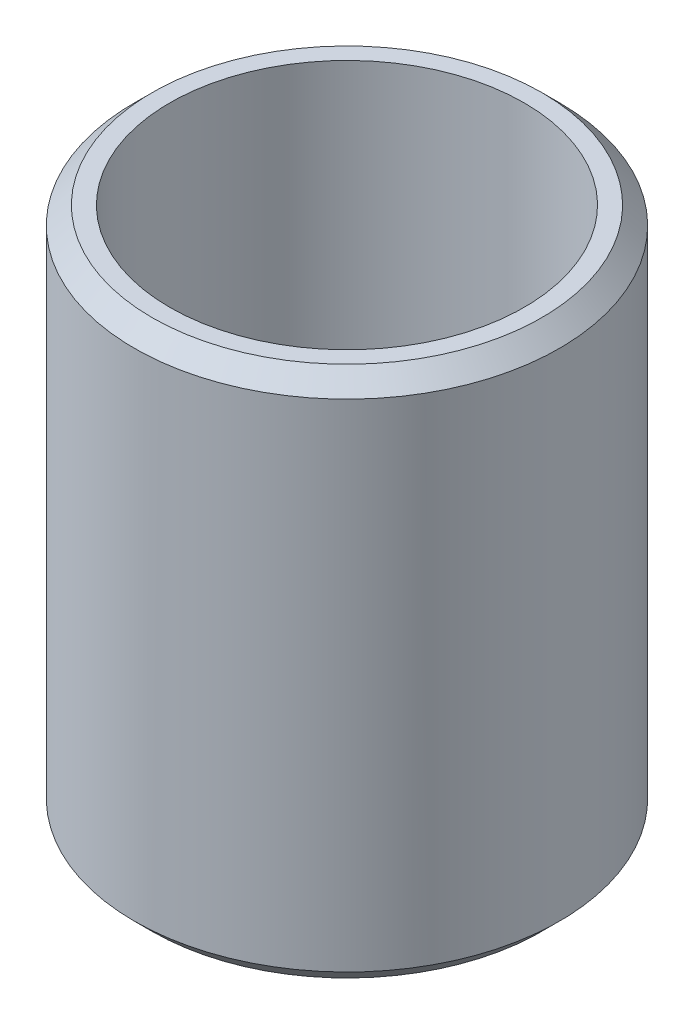
ISO-10303-21;
HEADER;
FILE_DESCRIPTION(('STEP AP214'),'2;1');
FILE_NAME('part.step','',(''),(''),'','','');
FILE_SCHEMA(('AUTOMOTIVE_DESIGN { 1 0 10303 214 1 1 1 1 }'));
ENDSEC;
DATA;
#1=APPLICATION_CONTEXT('core data for automotive mechanical design processes');
#2=APPLICATION_PROTOCOL_DEFINITION('international standard','automotive_design',2000,#1);
#3=PRODUCT_CONTEXT('',#1,'mechanical');
#4=PRODUCT('Part','Part','',(#3));
#5=PRODUCT_RELATED_PRODUCT_CATEGORY('part','',(#4));
#6=PRODUCT_DEFINITION_FORMATION('','',#4);
#7=PRODUCT_DEFINITION_CONTEXT('part definition',#1,'design');
#8=PRODUCT_DEFINITION('design','',#6,#7);
#9=PRODUCT_DEFINITION_SHAPE('','',#8);
#10=(LENGTH_UNIT() NAMED_UNIT(*) SI_UNIT(.MILLI.,.METRE.));
#11=(NAMED_UNIT(*) PLANE_ANGLE_UNIT() SI_UNIT($,.RADIAN.));
#12=(NAMED_UNIT(*) SI_UNIT($,.STERADIAN.) SOLID_ANGLE_UNIT());
#13=UNCERTAINTY_MEASURE_WITH_UNIT(LENGTH_MEASURE(1.E-05),#10,'distance_accuracy_value','');
#14=(GEOMETRIC_REPRESENTATION_CONTEXT(3) GLOBAL_UNCERTAINTY_ASSIGNED_CONTEXT((#13)) GLOBAL_UNIT_ASSIGNED_CONTEXT((#10,
#11,#12)) REPRESENTATION_CONTEXT('',''));
#15=CARTESIAN_POINT('',(0.,0.,0.));
#16=DIRECTION('',(0.,0.,1.));
#17=DIRECTION('',(1.,0.,0.));
#18=AXIS2_PLACEMENT_3D('',#15,#16,#17);
#19=CARTESIAN_POINT('',(0.,3.81,0.));
#20=DIRECTION('',(0.,1.,0.));
#21=DIRECTION('',(0.,0.,1.));
#22=AXIS2_PLACEMENT_3D('',#19,#20,#21);
#23=PLANE('',#22);
#24=CARTESIAN_POINT('',(0.,3.81,0.));
#25=DIRECTION('',(0.,1.,0.));
#26=DIRECTION('',(0.,0.,1.));
#27=AXIS2_PLACEMENT_3D('',#24,#25,#26);
#28=CIRCLE('',#27,1.397);
#29=CARTESIAN_POINT('',(0.,3.81,1.397));
#30=VERTEX_POINT('',#29);
#31=EDGE_CURVE('E10',#30,#30,#28,.T.);
#32=ORIENTED_EDGE('',*,*,#31,.T.);
#33=EDGE_LOOP('',(#32));
#34=FACE_BOUND('',#33,.T.);
#35=CARTESIAN_POINT('',(0.,3.81,0.));
#36=DIRECTION('',(0.,1.,0.));
#37=DIRECTION('',(0.,0.,1.));
#38=AXIS2_PLACEMENT_3D('',#35,#36,#37);
#39=CIRCLE('',#38,1.27);
#40=CARTESIAN_POINT('',(0.,3.81,-1.27));
#41=VERTEX_POINT('',#40);
#42=EDGE_CURVE('E65',#41,#41,#39,.T.);
#43=ORIENTED_EDGE('',*,*,#42,.F.);
#44=EDGE_LOOP('',(#43));
#45=FACE_BOUND('',#44,.T.);
#46=ADVANCED_FACE('F39',(#34,#45),#23,.T.);
#47=CARTESIAN_POINT('',(0.,0.,0.));
#48=DIRECTION('',(0.,1.,0.));
#49=DIRECTION('',(0.,0.,1.));
#50=AXIS2_PLACEMENT_3D('',#47,#48,#49);
#51=PLANE('',#50);
#52=CARTESIAN_POINT('',(0.,0.,0.));
#53=DIRECTION('',(0.,1.,0.));
#54=DIRECTION('',(0.,0.,1.));
#55=AXIS2_PLACEMENT_3D('',#52,#53,#54);
#56=CIRCLE('',#55,1.39699999999999);
#57=CARTESIAN_POINT('',(0.,0.,1.39699999999999));
#58=VERTEX_POINT('',#57);
#59=EDGE_CURVE('E47',#58,#58,#56,.F.);
#60=ORIENTED_EDGE('',*,*,#59,.T.);
#61=EDGE_LOOP('',(#60));
#62=FACE_BOUND('',#61,.T.);
#63=CARTESIAN_POINT('',(0.,0.,0.));
#64=DIRECTION('',(0.,1.,0.));
#65=DIRECTION('',(0.,0.,1.));
#66=AXIS2_PLACEMENT_3D('',#63,#64,#65);
#67=CIRCLE('',#66,1.27);
#68=CARTESIAN_POINT('',(0.,0.,-1.27));
#69=VERTEX_POINT('',#68);
#70=EDGE_CURVE('E66',#69,#69,#67,.T.);
#71=ORIENTED_EDGE('',*,*,#70,.T.);
#72=EDGE_LOOP('',(#71));
#73=FACE_BOUND('',#72,.T.);
#74=ADVANCED_FACE('F76',(#62,#73),#51,.F.);
#75=CARTESIAN_POINT('',(0.,3.81,0.));
#76=DIRECTION('',(0.,-1.,0.));
#77=DIRECTION('',(0.,0.,-1.));
#78=AXIS2_PLACEMENT_3D('',#75,#76,#77);
#79=CYLINDRICAL_SURFACE('',#78,1.524);
#80=CARTESIAN_POINT('',(0.,0.127000000000005,0.));
#81=DIRECTION('',(0.,1.,0.));
#82=DIRECTION('',(0.,0.,1.));
#83=AXIS2_PLACEMENT_3D('',#80,#81,#82);
#84=CIRCLE('',#83,1.524);
#85=CARTESIAN_POINT('',(0.,0.127000000000005,-1.524));
#86=VERTEX_POINT('',#85);
#87=EDGE_CURVE('E53',#86,#86,#84,.T.);
#88=CARTESIAN_POINT('',(0.,3.683,0.));
#89=DIRECTION('',(0.,1.,0.));
#90=DIRECTION('',(0.,0.,1.));
#91=AXIS2_PLACEMENT_3D('',#88,#89,#90);
#92=CIRCLE('',#91,1.524);
#93=CARTESIAN_POINT('',(0.,3.683,-1.524));
#94=VERTEX_POINT('',#93);
#95=EDGE_CURVE('E59',#94,#94,#92,.F.);
#96=CARTESIAN_POINT('',(0.,0.127000000000005,-1.524));
#97=CARTESIAN_POINT('',(0.,0.164041666666671,-1.524));
#98=CARTESIAN_POINT('',(0.,0.201083333333338,-1.524));
#99=CARTESIAN_POINT('',(0.,0.275166666666671,-1.524));
#100=CARTESIAN_POINT('',(0.,0.312208333333338,-1.524));
#101=CARTESIAN_POINT('',(0.,0.386291666666671,-1.524));
#102=CARTESIAN_POINT('',(0.,0.423333333333338,-1.524));
#103=CARTESIAN_POINT('',(0.,0.497416666666671,-1.524));
#104=CARTESIAN_POINT('',(0.,0.534458333333338,-1.524));
#105=CARTESIAN_POINT('',(0.,0.608541666666671,-1.524));
#106=CARTESIAN_POINT('',(0.,0.645583333333338,-1.524));
#107=CARTESIAN_POINT('',(0.,0.719666666666671,-1.524));
#108=CARTESIAN_POINT('',(0.,0.756708333333338,-1.524));
#109=CARTESIAN_POINT('',(0.,0.830791666666671,-1.524));
#110=CARTESIAN_POINT('',(0.,0.867833333333338,-1.524));
#111=CARTESIAN_POINT('',(0.,0.941916666666671,-1.524));
#112=CARTESIAN_POINT('',(0.,0.978958333333338,-1.524));
#113=CARTESIAN_POINT('',(0.,1.05304166666667,-1.524));
#114=CARTESIAN_POINT('',(0.,1.09008333333334,-1.524));
#115=CARTESIAN_POINT('',(0.,1.16416666666667,-1.524));
#116=CARTESIAN_POINT('',(0.,1.20120833333334,-1.524));
#117=CARTESIAN_POINT('',(0.,1.27529166666667,-1.524));
#118=CARTESIAN_POINT('',(0.,1.31233333333334,-1.524));
#119=CARTESIAN_POINT('',(0.,1.38641666666667,-1.524));
#120=CARTESIAN_POINT('',(0.,1.42345833333334,-1.524));
#121=CARTESIAN_POINT('',(0.,1.49754166666667,-1.524));
#122=CARTESIAN_POINT('',(0.,1.53458333333334,-1.524));
#123=CARTESIAN_POINT('',(0.,1.60866666666667,-1.524));
#124=CARTESIAN_POINT('',(0.,1.64570833333334,-1.524));
#125=CARTESIAN_POINT('',(0.,1.71979166666667,-1.524));
#126=CARTESIAN_POINT('',(0.,1.75683333333334,-1.524));
#127=CARTESIAN_POINT('',(0.,1.83091666666667,-1.524));
#128=CARTESIAN_POINT('',(0.,1.86795833333334,-1.524));
#129=CARTESIAN_POINT('',(0.,1.94204166666667,-1.524));
#130=CARTESIAN_POINT('',(0.,1.97908333333334,-1.524));
#131=CARTESIAN_POINT('',(0.,2.05316666666667,-1.524));
#132=CARTESIAN_POINT('',(0.,2.09020833333334,-1.524));
#133=CARTESIAN_POINT('',(0.,2.16429166666667,-1.524));
#134=CARTESIAN_POINT('',(0.,2.20133333333334,-1.524));
#135=CARTESIAN_POINT('',(0.,2.27541666666667,-1.524));
#136=CARTESIAN_POINT('',(0.,2.31245833333334,-1.524));
#137=CARTESIAN_POINT('',(0.,2.38654166666667,-1.524));
#138=CARTESIAN_POINT('',(0.,2.42358333333334,-1.524));
#139=CARTESIAN_POINT('',(0.,2.49766666666667,-1.524));
#140=CARTESIAN_POINT('',(0.,2.53470833333334,-1.524));
#141=CARTESIAN_POINT('',(0.,2.60879166666667,-1.524));
#142=CARTESIAN_POINT('',(0.,2.64583333333334,-1.524));
#143=CARTESIAN_POINT('',(0.,2.71991666666667,-1.524));
#144=CARTESIAN_POINT('',(0.,2.75695833333334,-1.524));
#145=CARTESIAN_POINT('',(0.,2.83104166666667,-1.524));
#146=CARTESIAN_POINT('',(0.,2.86808333333334,-1.524));
#147=CARTESIAN_POINT('',(0.,2.94216666666667,-1.524));
#148=CARTESIAN_POINT('',(0.,2.97920833333334,-1.524));
#149=CARTESIAN_POINT('',(0.,3.05329166666667,-1.524));
#150=CARTESIAN_POINT('',(0.,3.09033333333334,-1.524));
#151=CARTESIAN_POINT('',(0.,3.16441666666667,-1.524));
#152=CARTESIAN_POINT('',(0.,3.20145833333334,-1.524));
#153=CARTESIAN_POINT('',(0.,3.27554166666667,-1.524));
#154=CARTESIAN_POINT('',(0.,3.31258333333334,-1.524));
#155=CARTESIAN_POINT('',(0.,3.38666666666667,-1.524));
#156=CARTESIAN_POINT('',(0.,3.42370833333334,-1.524));
#157=CARTESIAN_POINT('',(0.,3.49779166666667,-1.524));
#158=CARTESIAN_POINT('',(0.,3.53483333333334,-1.524));
#159=CARTESIAN_POINT('',(0.,3.60891666666667,-1.524));
#160=CARTESIAN_POINT('',(0.,3.64595833333334,-1.524));
#161=CARTESIAN_POINT('',(0.,3.683,-1.524));
#162=B_SPLINE_CURVE_WITH_KNOTS('',3,(#96,#97,#98,#99,#100,#101,#102,#103,#104,#105,#106,#107,
#108,#109,#110,#111,#112,#113,#114,#115,#116,#117,#118,#119,#120,#121,#122,#123,#124,#125,#126,
#127,#128,#129,#130,#131,#132,#133,#134,#135,#136,#137,#138,#139,#140,#141,#142,#143,#144,#145,
#146,#147,#148,#149,#150,#151,#152,#153,#154,#155,#156,#157,#158,#159,#160,#161),.UNSPECIFIED.,
.F.,.F.,(4,2,2,2,2,2,2,2,2,2,2,2,2,2,2,2,2,2,2,2,2,2,2,2,2,2,2,2,2,2,2,2,4),(0.,0.111125,
0.22225,0.333375,0.4445,0.555625,0.66675,0.777875,0.889,1.000125,1.11125,1.222375,1.3335,
1.444625,1.55575,1.666875,1.778,1.889125,2.00025,2.111375,2.2225,2.333625,2.44475,2.555875,
2.667,2.778125,2.88925,3.000375,3.1115,3.222625,3.33375,3.444875,3.556),.UNSPECIFIED.);
#163=EDGE_CURVE('BSEAM81',#86,#94,#162,.T.);
#164=ORIENTED_EDGE('',*,*,#87,.T.);
#165=ORIENTED_EDGE('',*,*,#95,.T.);
#166=ORIENTED_EDGE('',*,*,#163,.T.);
#167=ORIENTED_EDGE('',*,*,#163,.F.);
#168=EDGE_LOOP('',(#164,#166,#165,#167));
#169=FACE_BOUND('',#168,.T.);
#170=ADVANCED_FACE('F81',(#169),#79,.T.);
#171=CARTESIAN_POINT('',(0.,3.81,0.));
#172=DIRECTION('',(0.,-1.,0.));
#173=DIRECTION('',(0.,0.,-1.));
#174=AXIS2_PLACEMENT_3D('',#171,#172,#173);
#175=CYLINDRICAL_SURFACE('',#174,1.27);
#176=CARTESIAN_POINT('',(0.,3.81,-1.27));
#177=CARTESIAN_POINT('',(0.,3.7703125,-1.27));
#178=CARTESIAN_POINT('',(0.,3.730625,-1.27));
#179=CARTESIAN_POINT('',(0.,3.65125,-1.27));
#180=CARTESIAN_POINT('',(0.,3.6115625,-1.27));
#181=CARTESIAN_POINT('',(0.,3.5321875,-1.27));
#182=CARTESIAN_POINT('',(0.,3.4925,-1.27));
#183=CARTESIAN_POINT('',(0.,3.413125,-1.27));
#184=CARTESIAN_POINT('',(0.,3.3734375,-1.27));
#185=CARTESIAN_POINT('',(0.,3.2940625,-1.27));
#186=CARTESIAN_POINT('',(0.,3.254375,-1.27));
#187=CARTESIAN_POINT('',(0.,3.175,-1.27));
#188=CARTESIAN_POINT('',(0.,3.1353125,-1.27));
#189=CARTESIAN_POINT('',(0.,3.0559375,-1.27));
#190=CARTESIAN_POINT('',(0.,3.01625,-1.27));
#191=CARTESIAN_POINT('',(0.,2.936875,-1.27));
#192=CARTESIAN_POINT('',(0.,2.8971875,-1.27));
#193=CARTESIAN_POINT('',(0.,2.8178125,-1.27));
#194=CARTESIAN_POINT('',(0.,2.778125,-1.27));
#195=CARTESIAN_POINT('',(0.,2.69875,-1.27));
#196=CARTESIAN_POINT('',(0.,2.6590625,-1.27));
#197=CARTESIAN_POINT('',(0.,2.5796875,-1.27));
#198=CARTESIAN_POINT('',(0.,2.54,-1.27));
#199=CARTESIAN_POINT('',(0.,2.460625,-1.27));
#200=CARTESIAN_POINT('',(0.,2.4209375,-1.27));
#201=CARTESIAN_POINT('',(0.,2.3415625,-1.27));
#202=CARTESIAN_POINT('',(0.,2.301875,-1.27));
#203=CARTESIAN_POINT('',(0.,2.2225,-1.27));
#204=CARTESIAN_POINT('',(0.,2.1828125,-1.27));
#205=CARTESIAN_POINT('',(0.,2.1034375,-1.27));
#206=CARTESIAN_POINT('',(0.,2.06375,-1.27));
#207=CARTESIAN_POINT('',(0.,1.984375,-1.27));
#208=CARTESIAN_POINT('',(0.,1.9446875,-1.27));
#209=CARTESIAN_POINT('',(0.,1.8653125,-1.27));
#210=CARTESIAN_POINT('',(0.,1.825625,-1.27));
#211=CARTESIAN_POINT('',(0.,1.74625,-1.27));
#212=CARTESIAN_POINT('',(0.,1.7065625,-1.27));
#213=CARTESIAN_POINT('',(0.,1.6271875,-1.27));
#214=CARTESIAN_POINT('',(0.,1.5875,-1.27));
#215=CARTESIAN_POINT('',(0.,1.508125,-1.27));
#216=CARTESIAN_POINT('',(0.,1.4684375,-1.27));
#217=CARTESIAN_POINT('',(0.,1.3890625,-1.27));
#218=CARTESIAN_POINT('',(0.,1.349375,-1.27));
#219=CARTESIAN_POINT('',(0.,1.27,-1.27));
#220=CARTESIAN_POINT('',(0.,1.2303125,-1.27));
#221=CARTESIAN_POINT('',(0.,1.1509375,-1.27));
#222=CARTESIAN_POINT('',(0.,1.11125,-1.27));
#223=CARTESIAN_POINT('',(0.,1.031875,-1.27));
#224=CARTESIAN_POINT('',(0.,0.9921875,-1.27));
#225=CARTESIAN_POINT('',(0.,0.9128125,-1.27));
#226=CARTESIAN_POINT('',(0.,0.873125,-1.27));
#227=CARTESIAN_POINT('',(0.,0.79375,-1.27));
#228=CARTESIAN_POINT('',(0.,0.7540625,-1.27));
#229=CARTESIAN_POINT('',(0.,0.6746875,-1.27));
#230=CARTESIAN_POINT('',(0.,0.635,-1.27));
#231=CARTESIAN_POINT('',(0.,0.555625,-1.27));
#232=CARTESIAN_POINT('',(0.,0.5159375,-1.27));
#233=CARTESIAN_POINT('',(0.,0.4365625,-1.27));
#234=CARTESIAN_POINT('',(0.,0.396875,-1.27));
#235=CARTESIAN_POINT('',(0.,0.3175,-1.27));
#236=CARTESIAN_POINT('',(0.,0.2778125,-1.27));
#237=CARTESIAN_POINT('',(0.,0.1984375,-1.27));
#238=CARTESIAN_POINT('',(0.,0.15875,-1.27));
#239=CARTESIAN_POINT('',(0.,0.0793749999999999,-1.27));
#240=CARTESIAN_POINT('',(0.,0.0396874999999999,-1.27));
#241=CARTESIAN_POINT('',(0.,0.,-1.27));
#242=B_SPLINE_CURVE_WITH_KNOTS('',3,(#176,#177,#178,#179,#180,#181,#182,#183,#184,#185,#186,
#187,#188,#189,#190,#191,#192,#193,#194,#195,#196,#197,#198,#199,#200,#201,#202,#203,#204,#205,
#206,#207,#208,#209,#210,#211,#212,#213,#214,#215,#216,#217,#218,#219,#220,#221,#222,#223,#224,
#225,#226,#227,#228,#229,#230,#231,#232,#233,#234,#235,#236,#237,#238,#239,#240,#241),
.UNSPECIFIED.,.F.,.F.,(4,2,2,2,2,2,2,2,2,2,2,2,2,2,2,2,2,2,2,2,2,2,2,2,2,2,2,2,2,2,2,2,4),(0.,
0.1190625,0.238125,0.3571875,0.47625,0.5953125,0.714375,0.8334375,0.9525,1.0715625,1.190625,
1.3096875,1.42875,1.5478125,1.666875,1.7859375,1.905,2.0240625,2.143125,2.2621875,2.38125,
2.5003125,2.619375,2.7384375,2.8575,2.9765625,3.095625,3.2146875,3.33375,3.4528125,3.571875,
3.6909375,3.81),.UNSPECIFIED.);
#243=EDGE_CURVE('BSEAM72',#41,#69,#242,.T.);
#244=ORIENTED_EDGE('',*,*,#42,.T.);
#245=ORIENTED_EDGE('',*,*,#70,.F.);
#246=ORIENTED_EDGE('',*,*,#243,.T.);
#247=ORIENTED_EDGE('',*,*,#243,.F.);
#248=EDGE_LOOP('',(#244,#246,#245,#247));
#249=FACE_BOUND('',#248,.T.);
#250=ADVANCED_FACE('F72',(#249),#175,.F.);
#251=CARTESIAN_POINT('',(0.,0.127000000000005,0.));
#252=DIRECTION('',(0.,1.,0.));
#253=DIRECTION('',(0.,0.,1.));
#254=AXIS2_PLACEMENT_3D('',#251,#252,#253);
#255=CONICAL_SURFACE('',#254,1.524,0.78539816339745);
#256=ORIENTED_EDGE('',*,*,#59,.F.);
#257=EDGE_LOOP('',(#256));
#258=FACE_BOUND('',#257,.T.);
#259=ORIENTED_EDGE('',*,*,#87,.F.);
#260=EDGE_LOOP('',(#259));
#261=FACE_BOUND('',#260,.T.);
#262=ADVANCED_FACE('F87',(#258,#261),#255,.T.);
#263=CARTESIAN_POINT('',(0.,3.81,0.));
#264=DIRECTION('',(0.,-1.,0.));
#265=DIRECTION('',(0.,0.,-1.));
#266=AXIS2_PLACEMENT_3D('',#263,#264,#265);
#267=CONICAL_SURFACE('',#266,1.397,0.785398163397448);
#268=ORIENTED_EDGE('',*,*,#95,.F.);
#269=EDGE_LOOP('',(#268));
#270=FACE_BOUND('',#269,.T.);
#271=ORIENTED_EDGE('',*,*,#31,.F.);
#272=EDGE_LOOP('',(#271));
#273=FACE_BOUND('',#272,.T.);
#274=ADVANCED_FACE('F41',(#270,#273),#267,.T.);
#275=CLOSED_SHELL('',(#46,#74,#170,#250,#262,#274));
#276=MANIFOLD_SOLID_BREP('B2',#275);
#277=ADVANCED_BREP_SHAPE_REPRESENTATION('',(#18,#276),#14);
#278=SHAPE_DEFINITION_REPRESENTATION(#9,#277);
ENDSEC;
END-ISO-10303-21;
